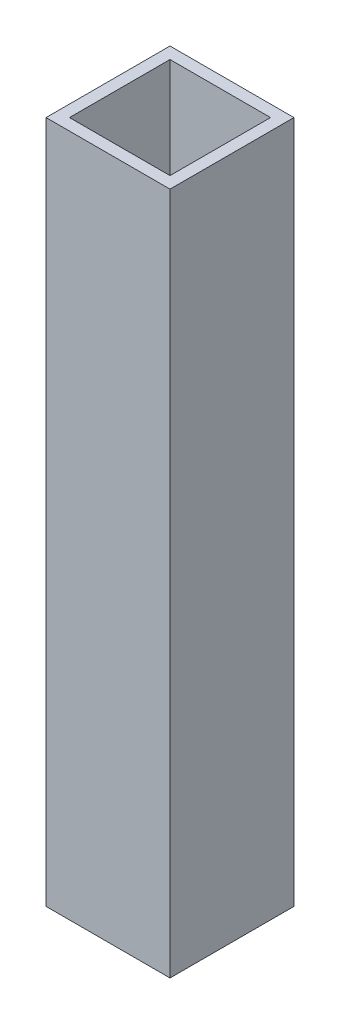
ISO-10303-21;
HEADER;
FILE_DESCRIPTION(('STEP AP214'),'2;1');
FILE_NAME('part.step','',(''),(''),'','','');
FILE_SCHEMA(('AUTOMOTIVE_DESIGN { 1 0 10303 214 1 1 1 1 }'));
ENDSEC;
DATA;
#1=APPLICATION_CONTEXT('core data for automotive mechanical design processes');
#2=APPLICATION_PROTOCOL_DEFINITION('international standard','automotive_design',2000,#1);
#3=PRODUCT_CONTEXT('',#1,'mechanical');
#4=PRODUCT('Part','Part','',(#3));
#5=PRODUCT_RELATED_PRODUCT_CATEGORY('part','',(#4));
#6=PRODUCT_DEFINITION_FORMATION('','',#4);
#7=PRODUCT_DEFINITION_CONTEXT('part definition',#1,'design');
#8=PRODUCT_DEFINITION('design','',#6,#7);
#9=PRODUCT_DEFINITION_SHAPE('','',#8);
#10=(LENGTH_UNIT() NAMED_UNIT(*) SI_UNIT(.MILLI.,.METRE.));
#11=(NAMED_UNIT(*) PLANE_ANGLE_UNIT() SI_UNIT($,.RADIAN.));
#12=(NAMED_UNIT(*) SI_UNIT($,.STERADIAN.) SOLID_ANGLE_UNIT());
#13=UNCERTAINTY_MEASURE_WITH_UNIT(LENGTH_MEASURE(1.E-05),#10,'distance_accuracy_value','');
#14=(GEOMETRIC_REPRESENTATION_CONTEXT(3) GLOBAL_UNCERTAINTY_ASSIGNED_CONTEXT((#13)) GLOBAL_UNIT_ASSIGNED_CONTEXT((#10,
#11,#12)) REPRESENTATION_CONTEXT('',''));
#15=CARTESIAN_POINT('',(0.,0.,0.));
#16=DIRECTION('',(0.,0.,1.));
#17=DIRECTION('',(1.,0.,0.));
#18=AXIS2_PLACEMENT_3D('',#15,#16,#17);
#19=CARTESIAN_POINT('',(0.,70.,0.));
#20=DIRECTION('',(0.,1.,0.));
#21=DIRECTION('',(0.,0.,1.));
#22=AXIS2_PLACEMENT_3D('',#19,#20,#21);
#23=PLANE('',#22);
#24=DIRECTION('',(0.,0.,-1.));
#25=VECTOR('',#24,1.);
#26=CARTESIAN_POINT('',(6.35,70.,-6.35));
#27=LINE('',#26,#25);
#28=CARTESIAN_POINT('',(6.35,70.,6.35));
#29=VERTEX_POINT('',#28);
#30=CARTESIAN_POINT('',(6.35,70.,-6.35));
#31=VERTEX_POINT('',#30);
#32=EDGE_CURVE('E158',#29,#31,#27,.T.);
#33=ORIENTED_EDGE('',*,*,#32,.T.);
#34=DIRECTION('',(-1.,0.,0.));
#35=VECTOR('',#34,1.);
#36=CARTESIAN_POINT('',(-6.35,70.,-6.35));
#37=LINE('',#36,#35);
#38=CARTESIAN_POINT('',(-6.35,70.,-6.35));
#39=VERTEX_POINT('',#38);
#40=EDGE_CURVE('E161',#31,#39,#37,.T.);
#41=ORIENTED_EDGE('',*,*,#40,.T.);
#42=DIRECTION('',(0.,0.,1.));
#43=VECTOR('',#42,1.);
#44=CARTESIAN_POINT('',(-6.35,70.,-6.35));
#45=LINE('',#44,#43);
#46=CARTESIAN_POINT('',(-6.35,70.,6.35));
#47=VERTEX_POINT('',#46);
#48=EDGE_CURVE('E164',#39,#47,#45,.T.);
#49=ORIENTED_EDGE('',*,*,#48,.T.);
#50=DIRECTION('',(1.,0.,0.));
#51=VECTOR('',#50,1.);
#52=CARTESIAN_POINT('',(-6.35,70.,6.35));
#53=LINE('',#52,#51);
#54=EDGE_CURVE('E166',#47,#29,#53,.T.);
#55=ORIENTED_EDGE('',*,*,#54,.T.);
#56=EDGE_LOOP('',(#33,#41,#49,#55));
#57=FACE_BOUND('',#56,.T.);
#58=DIRECTION('',(-1.,0.,0.));
#59=VECTOR('',#58,1.);
#60=CARTESIAN_POINT('',(-6.35,70.,-5.15));
#61=LINE('',#60,#59);
#62=CARTESIAN_POINT('',(5.15,70.,-5.15));
#63=VERTEX_POINT('',#62);
#64=CARTESIAN_POINT('',(-5.15,70.,-5.15));
#65=VERTEX_POINT('',#64);
#66=EDGE_CURVE('E130',#63,#65,#61,.T.);
#67=ORIENTED_EDGE('',*,*,#66,.F.);
#68=DIRECTION('',(0.,0.,-1.));
#69=VECTOR('',#68,1.);
#70=CARTESIAN_POINT('',(5.15,70.,-6.35));
#71=LINE('',#70,#69);
#72=CARTESIAN_POINT('',(5.15,70.,5.15));
#73=VERTEX_POINT('',#72);
#74=EDGE_CURVE('E122',#73,#63,#71,.T.);
#75=ORIENTED_EDGE('',*,*,#74,.F.);
#76=DIRECTION('',(1.,0.,0.));
#77=VECTOR('',#76,1.);
#78=CARTESIAN_POINT('',(-6.35,70.,5.15));
#79=LINE('',#78,#77);
#80=CARTESIAN_POINT('',(-5.15,70.,5.15));
#81=VERTEX_POINT('',#80);
#82=EDGE_CURVE('E144',#81,#73,#79,.T.);
#83=ORIENTED_EDGE('',*,*,#82,.F.);
#84=DIRECTION('',(0.,0.,1.));
#85=VECTOR('',#84,1.);
#86=CARTESIAN_POINT('',(-5.15,70.,-6.35));
#87=LINE('',#86,#85);
#88=EDGE_CURVE('E142',#65,#81,#87,.T.);
#89=ORIENTED_EDGE('',*,*,#88,.F.);
#90=EDGE_LOOP('',(#67,#75,#83,#89));
#91=FACE_BOUND('',#90,.T.);
#92=ADVANCED_FACE('F57',(#57,#91),#23,.T.);
#93=CARTESIAN_POINT('',(0.,0.,0.));
#94=DIRECTION('',(0.,1.,0.));
#95=DIRECTION('',(0.,0.,1.));
#96=AXIS2_PLACEMENT_3D('',#93,#94,#95);
#97=PLANE('',#96);
#98=DIRECTION('',(0.,0.,-1.));
#99=VECTOR('',#98,1.);
#100=CARTESIAN_POINT('',(6.35,0.,-6.35));
#101=LINE('',#100,#99);
#102=CARTESIAN_POINT('',(6.35,0.,6.35));
#103=VERTEX_POINT('',#102);
#104=CARTESIAN_POINT('',(6.35,0.,-6.35));
#105=VERTEX_POINT('',#104);
#106=EDGE_CURVE('E138',#103,#105,#101,.T.);
#107=ORIENTED_EDGE('',*,*,#106,.F.);
#108=DIRECTION('',(1.,0.,0.));
#109=VECTOR('',#108,1.);
#110=CARTESIAN_POINT('',(-6.35,0.,6.35));
#111=LINE('',#110,#109);
#112=CARTESIAN_POINT('',(-6.35,0.,6.35));
#113=VERTEX_POINT('',#112);
#114=EDGE_CURVE('E162',#113,#103,#111,.T.);
#115=ORIENTED_EDGE('',*,*,#114,.F.);
#116=DIRECTION('',(0.,0.,1.));
#117=VECTOR('',#116,1.);
#118=CARTESIAN_POINT('',(-6.35,0.,-6.35));
#119=LINE('',#118,#117);
#120=CARTESIAN_POINT('',(-6.35,0.,-6.35));
#121=VERTEX_POINT('',#120);
#122=EDGE_CURVE('E173',#121,#113,#119,.T.);
#123=ORIENTED_EDGE('',*,*,#122,.F.);
#124=DIRECTION('',(-1.,0.,0.));
#125=VECTOR('',#124,1.);
#126=CARTESIAN_POINT('',(-6.35,0.,-6.35));
#127=LINE('',#126,#125);
#128=EDGE_CURVE('E171',#105,#121,#127,.T.);
#129=ORIENTED_EDGE('',*,*,#128,.F.);
#130=EDGE_LOOP('',(#107,#115,#123,#129));
#131=FACE_BOUND('',#130,.T.);
#132=DIRECTION('',(0.,0.,-1.));
#133=VECTOR('',#132,1.);
#134=CARTESIAN_POINT('',(5.15,0.,-6.35));
#135=LINE('',#134,#133);
#136=CARTESIAN_POINT('',(5.15,0.,5.15));
#137=VERTEX_POINT('',#136);
#138=CARTESIAN_POINT('',(5.15,0.,-5.15));
#139=VERTEX_POINT('',#138);
#140=EDGE_CURVE('E80',#137,#139,#135,.T.);
#141=ORIENTED_EDGE('',*,*,#140,.T.);
#142=DIRECTION('',(-1.,0.,0.));
#143=VECTOR('',#142,1.);
#144=CARTESIAN_POINT('',(-6.35,0.,-5.15));
#145=LINE('',#144,#143);
#146=CARTESIAN_POINT('',(-5.15,0.,-5.15));
#147=VERTEX_POINT('',#146);
#148=EDGE_CURVE('E137',#139,#147,#145,.T.);
#149=ORIENTED_EDGE('',*,*,#148,.T.);
#150=DIRECTION('',(0.,0.,1.));
#151=VECTOR('',#150,1.);
#152=CARTESIAN_POINT('',(-5.15,0.,-6.35));
#153=LINE('',#152,#151);
#154=CARTESIAN_POINT('',(-5.15,0.,5.15));
#155=VERTEX_POINT('',#154);
#156=EDGE_CURVE('E150',#147,#155,#153,.T.);
#157=ORIENTED_EDGE('',*,*,#156,.T.);
#158=DIRECTION('',(1.,0.,0.));
#159=VECTOR('',#158,1.);
#160=CARTESIAN_POINT('',(-6.35,0.,5.15));
#161=LINE('',#160,#159);
#162=EDGE_CURVE('E131',#155,#137,#161,.T.);
#163=ORIENTED_EDGE('',*,*,#162,.T.);
#164=EDGE_LOOP('',(#141,#149,#157,#163));
#165=FACE_BOUND('',#164,.T.);
#166=ADVANCED_FACE('F191',(#131,#165),#97,.F.);
#167=CARTESIAN_POINT('',(6.35,70.,-6.35));
#168=DIRECTION('',(-1.,0.,0.));
#169=DIRECTION('',(0.,0.,1.));
#170=AXIS2_PLACEMENT_3D('',#167,#168,#169);
#171=PLANE('',#170);
#172=ORIENTED_EDGE('',*,*,#106,.T.);
#173=DIRECTION('',(0.,-1.,0.));
#174=VECTOR('',#173,1.);
#175=CARTESIAN_POINT('',(6.35,70.,-6.35));
#176=LINE('',#175,#174);
#177=EDGE_CURVE('E12',#31,#105,#176,.T.);
#178=ORIENTED_EDGE('',*,*,#177,.F.);
#179=ORIENTED_EDGE('',*,*,#32,.F.);
#180=DIRECTION('',(0.,-1.,0.));
#181=VECTOR('',#180,1.);
#182=CARTESIAN_POINT('',(6.35,70.,6.35));
#183=LINE('',#182,#181);
#184=EDGE_CURVE('E168',#29,#103,#183,.T.);
#185=ORIENTED_EDGE('',*,*,#184,.T.);
#186=EDGE_LOOP('',(#172,#178,#179,#185));
#187=FACE_BOUND('',#186,.T.);
#188=ADVANCED_FACE('F59',(#187),#171,.F.);
#189=CARTESIAN_POINT('',(-6.35,70.,-6.35));
#190=DIRECTION('',(0.,0.,1.));
#191=DIRECTION('',(1.,0.,0.));
#192=AXIS2_PLACEMENT_3D('',#189,#190,#191);
#193=PLANE('',#192);
#194=ORIENTED_EDGE('',*,*,#128,.T.);
#195=DIRECTION('',(0.,-1.,0.));
#196=VECTOR('',#195,1.);
#197=CARTESIAN_POINT('',(-6.35,70.,-6.35));
#198=LINE('',#197,#196);
#199=EDGE_CURVE('E65',#39,#121,#198,.T.);
#200=ORIENTED_EDGE('',*,*,#199,.F.);
#201=ORIENTED_EDGE('',*,*,#40,.F.);
#202=ORIENTED_EDGE('',*,*,#177,.T.);
#203=EDGE_LOOP('',(#194,#200,#201,#202));
#204=FACE_BOUND('',#203,.T.);
#205=ADVANCED_FACE('F201',(#204),#193,.F.);
#206=CARTESIAN_POINT('',(-6.35,70.,-6.35));
#207=DIRECTION('',(1.,0.,0.));
#208=DIRECTION('',(0.,0.,-1.));
#209=AXIS2_PLACEMENT_3D('',#206,#207,#208);
#210=PLANE('',#209);
#211=ORIENTED_EDGE('',*,*,#122,.T.);
#212=DIRECTION('',(0.,-1.,0.));
#213=VECTOR('',#212,1.);
#214=CARTESIAN_POINT('',(-6.35,70.,6.35));
#215=LINE('',#214,#213);
#216=EDGE_CURVE('E178',#47,#113,#215,.T.);
#217=ORIENTED_EDGE('',*,*,#216,.F.);
#218=ORIENTED_EDGE('',*,*,#48,.F.);
#219=ORIENTED_EDGE('',*,*,#199,.T.);
#220=EDGE_LOOP('',(#211,#217,#218,#219));
#221=FACE_BOUND('',#220,.T.);
#222=ADVANCED_FACE('F185',(#221),#210,.F.);
#223=CARTESIAN_POINT('',(-6.35,70.,6.35));
#224=DIRECTION('',(0.,0.,-1.));
#225=DIRECTION('',(-1.,0.,0.));
#226=AXIS2_PLACEMENT_3D('',#223,#224,#225);
#227=PLANE('',#226);
#228=ORIENTED_EDGE('',*,*,#114,.T.);
#229=ORIENTED_EDGE('',*,*,#184,.F.);
#230=ORIENTED_EDGE('',*,*,#54,.F.);
#231=ORIENTED_EDGE('',*,*,#216,.T.);
#232=EDGE_LOOP('',(#228,#229,#230,#231));
#233=FACE_BOUND('',#232,.T.);
#234=ADVANCED_FACE('F195',(#233),#227,.F.);
#235=CARTESIAN_POINT('',(5.15,70.,-6.35));
#236=DIRECTION('',(-1.,0.,0.));
#237=DIRECTION('',(0.,0.,1.));
#238=AXIS2_PLACEMENT_3D('',#235,#236,#237);
#239=PLANE('',#238);
#240=ORIENTED_EDGE('',*,*,#140,.F.);
#241=DIRECTION('',(0.,-1.,0.));
#242=VECTOR('',#241,1.);
#243=CARTESIAN_POINT('',(5.15,70.,5.15));
#244=LINE('',#243,#242);
#245=EDGE_CURVE('E126',#73,#137,#244,.T.);
#246=ORIENTED_EDGE('',*,*,#245,.F.);
#247=ORIENTED_EDGE('',*,*,#74,.T.);
#248=DIRECTION('',(0.,-1.,0.));
#249=VECTOR('',#248,1.);
#250=CARTESIAN_POINT('',(5.15,70.,-5.15));
#251=LINE('',#250,#249);
#252=EDGE_CURVE('E125',#63,#139,#251,.T.);
#253=ORIENTED_EDGE('',*,*,#252,.T.);
#254=EDGE_LOOP('',(#240,#246,#247,#253));
#255=FACE_BOUND('',#254,.T.);
#256=ADVANCED_FACE('F124',(#255),#239,.T.);
#257=CARTESIAN_POINT('',(-6.35,70.,-5.15));
#258=DIRECTION('',(0.,0.,1.));
#259=DIRECTION('',(1.,0.,0.));
#260=AXIS2_PLACEMENT_3D('',#257,#258,#259);
#261=PLANE('',#260);
#262=ORIENTED_EDGE('',*,*,#148,.F.);
#263=ORIENTED_EDGE('',*,*,#252,.F.);
#264=ORIENTED_EDGE('',*,*,#66,.T.);
#265=DIRECTION('',(0.,-1.,0.));
#266=VECTOR('',#265,1.);
#267=CARTESIAN_POINT('',(-5.15,70.,-5.15));
#268=LINE('',#267,#266);
#269=EDGE_CURVE('E139',#65,#147,#268,.T.);
#270=ORIENTED_EDGE('',*,*,#269,.T.);
#271=EDGE_LOOP('',(#262,#263,#264,#270));
#272=FACE_BOUND('',#271,.T.);
#273=ADVANCED_FACE('F134',(#272),#261,.T.);
#274=CARTESIAN_POINT('',(-5.15,70.,-6.35));
#275=DIRECTION('',(1.,0.,0.));
#276=DIRECTION('',(0.,0.,-1.));
#277=AXIS2_PLACEMENT_3D('',#274,#275,#276);
#278=PLANE('',#277);
#279=ORIENTED_EDGE('',*,*,#156,.F.);
#280=ORIENTED_EDGE('',*,*,#269,.F.);
#281=ORIENTED_EDGE('',*,*,#88,.T.);
#282=DIRECTION('',(0.,-1.,0.));
#283=VECTOR('',#282,1.);
#284=CARTESIAN_POINT('',(-5.15,70.,5.15));
#285=LINE('',#284,#283);
#286=EDGE_CURVE('E72',#81,#155,#285,.T.);
#287=ORIENTED_EDGE('',*,*,#286,.T.);
#288=EDGE_LOOP('',(#279,#280,#281,#287));
#289=FACE_BOUND('',#288,.T.);
#290=ADVANCED_FACE('F224',(#289),#278,.T.);
#291=CARTESIAN_POINT('',(-6.35,70.,5.15));
#292=DIRECTION('',(0.,0.,-1.));
#293=DIRECTION('',(-1.,0.,0.));
#294=AXIS2_PLACEMENT_3D('',#291,#292,#293);
#295=PLANE('',#294);
#296=ORIENTED_EDGE('',*,*,#162,.F.);
#297=ORIENTED_EDGE('',*,*,#286,.F.);
#298=ORIENTED_EDGE('',*,*,#82,.T.);
#299=ORIENTED_EDGE('',*,*,#245,.T.);
#300=EDGE_LOOP('',(#296,#297,#298,#299));
#301=FACE_BOUND('',#300,.T.);
#302=ADVANCED_FACE('F228',(#301),#295,.T.);
#303=CLOSED_SHELL('',(#92,#166,#188,#205,#222,#234,#256,#273,#290,#302));
#304=MANIFOLD_SOLID_BREP('B2',#303);
#305=ADVANCED_BREP_SHAPE_REPRESENTATION('',(#18,#304),#14);
#306=SHAPE_DEFINITION_REPRESENTATION(#9,#305);
ENDSEC;
END-ISO-10303-21;
